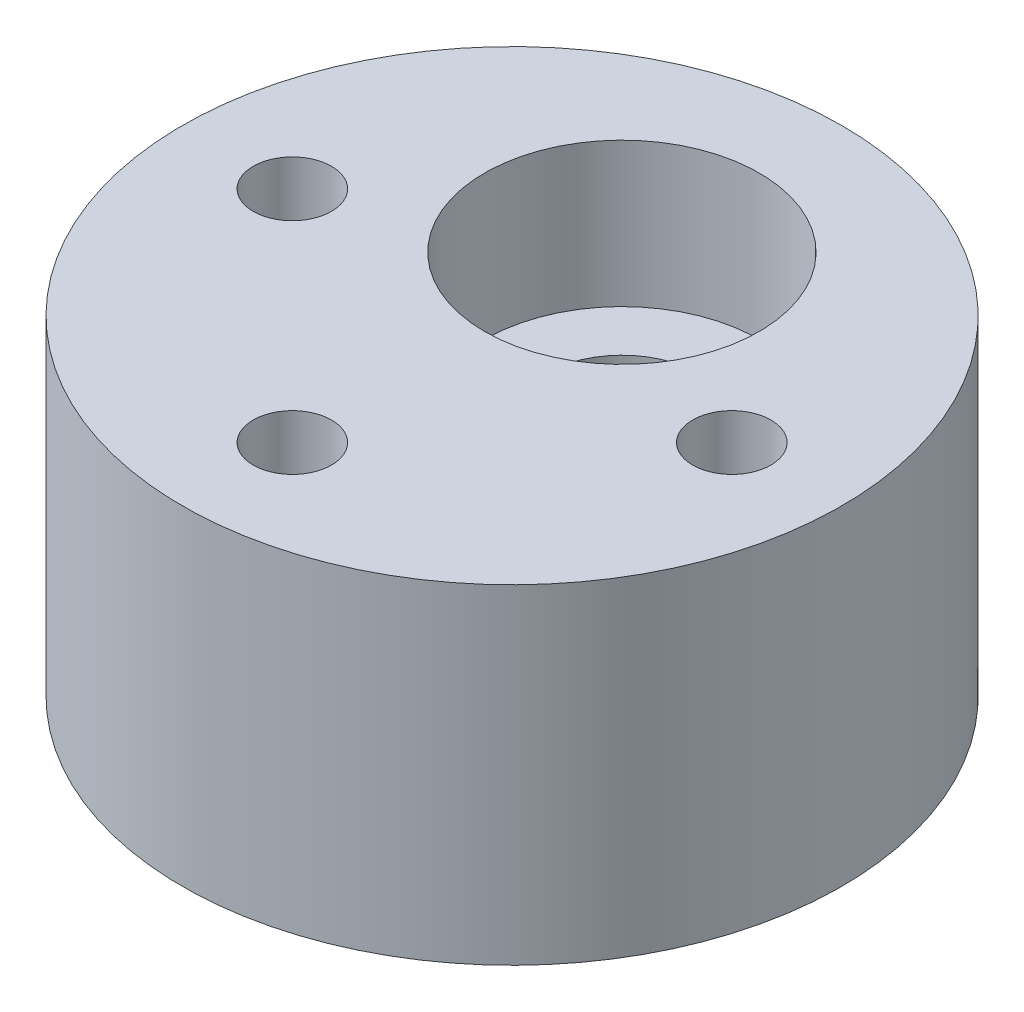
ISO-10303-21;
HEADER;
FILE_DESCRIPTION(('STEP AP214'),'2;1');
FILE_NAME('part.step','',(''),(''),'','','');
FILE_SCHEMA(('AUTOMOTIVE_DESIGN { 1 0 10303 214 1 1 1 1 }'));
ENDSEC;
DATA;
#1=APPLICATION_CONTEXT('core data for automotive mechanical design processes');
#2=APPLICATION_PROTOCOL_DEFINITION('international standard','automotive_design',2000,#1);
#3=PRODUCT_CONTEXT('',#1,'mechanical');
#4=PRODUCT('Part','Part','',(#3));
#5=PRODUCT_RELATED_PRODUCT_CATEGORY('part','',(#4));
#6=PRODUCT_DEFINITION_FORMATION('','',#4);
#7=PRODUCT_DEFINITION_CONTEXT('part definition',#1,'design');
#8=PRODUCT_DEFINITION('design','',#6,#7);
#9=PRODUCT_DEFINITION_SHAPE('','',#8);
#10=(LENGTH_UNIT() NAMED_UNIT(*) SI_UNIT(.MILLI.,.METRE.));
#11=(NAMED_UNIT(*) PLANE_ANGLE_UNIT() SI_UNIT($,.RADIAN.));
#12=(NAMED_UNIT(*) SI_UNIT($,.STERADIAN.) SOLID_ANGLE_UNIT());
#13=UNCERTAINTY_MEASURE_WITH_UNIT(LENGTH_MEASURE(1.E-05),#10,'distance_accuracy_value','');
#14=(GEOMETRIC_REPRESENTATION_CONTEXT(3) GLOBAL_UNCERTAINTY_ASSIGNED_CONTEXT((#13)) GLOBAL_UNIT_ASSIGNED_CONTEXT((#10,
#11,#12)) REPRESENTATION_CONTEXT('',''));
#15=CARTESIAN_POINT('',(0.,0.,0.));
#16=DIRECTION('',(0.,0.,1.));
#17=DIRECTION('',(1.,0.,0.));
#18=AXIS2_PLACEMENT_3D('',#15,#16,#17);
#19=CARTESIAN_POINT('',(0.,9.525,0.));
#20=DIRECTION('',(0.,-1.,0.));
#21=DIRECTION('',(0.,0.,-1.));
#22=AXIS2_PLACEMENT_3D('',#19,#20,#21);
#23=CYLINDRICAL_SURFACE('',#22,9.525);
#24=CARTESIAN_POINT('',(0.,9.525,0.));
#25=DIRECTION('',(0.,1.,0.));
#26=DIRECTION('',(0.,0.,1.));
#27=AXIS2_PLACEMENT_3D('',#24,#25,#26);
#28=CIRCLE('',#27,9.525);
#29=CARTESIAN_POINT('',(0.,9.525,-9.525));
#30=VERTEX_POINT('',#29);
#31=EDGE_CURVE('E11',#30,#30,#28,.T.);
#32=CARTESIAN_POINT('',(0.,0.,0.));
#33=DIRECTION('',(0.,1.,0.));
#34=DIRECTION('',(0.,0.,1.));
#35=AXIS2_PLACEMENT_3D('',#32,#33,#34);
#36=CIRCLE('',#35,9.525);
#37=CARTESIAN_POINT('',(0.,0.,-9.525));
#38=VERTEX_POINT('',#37);
#39=EDGE_CURVE('E43',#38,#38,#36,.T.);
#40=CARTESIAN_POINT('',(0.,9.525,-9.525));
#41=CARTESIAN_POINT('',(0.,9.42578125,-9.525));
#42=CARTESIAN_POINT('',(0.,9.3265625,-9.525));
#43=CARTESIAN_POINT('',(0.,9.128125,-9.525));
#44=CARTESIAN_POINT('',(0.,9.02890625,-9.525));
#45=CARTESIAN_POINT('',(0.,8.83046875,-9.525));
#46=CARTESIAN_POINT('',(0.,8.73125,-9.525));
#47=CARTESIAN_POINT('',(0.,8.5328125,-9.525));
#48=CARTESIAN_POINT('',(0.,8.43359375,-9.525));
#49=CARTESIAN_POINT('',(0.,8.23515625,-9.525));
#50=CARTESIAN_POINT('',(0.,8.1359375,-9.525));
#51=CARTESIAN_POINT('',(0.,7.9375,-9.525));
#52=CARTESIAN_POINT('',(0.,7.83828125,-9.525));
#53=CARTESIAN_POINT('',(0.,7.63984375,-9.525));
#54=CARTESIAN_POINT('',(0.,7.540625,-9.525));
#55=CARTESIAN_POINT('',(0.,7.3421875,-9.525));
#56=CARTESIAN_POINT('',(0.,7.24296875,-9.525));
#57=CARTESIAN_POINT('',(0.,7.04453125,-9.525));
#58=CARTESIAN_POINT('',(0.,6.9453125,-9.525));
#59=CARTESIAN_POINT('',(0.,6.746875,-9.525));
#60=CARTESIAN_POINT('',(0.,6.64765625,-9.525));
#61=CARTESIAN_POINT('',(0.,6.44921875,-9.525));
#62=CARTESIAN_POINT('',(0.,6.35,-9.525));
#63=CARTESIAN_POINT('',(0.,6.1515625,-9.525));
#64=CARTESIAN_POINT('',(0.,6.05234375,-9.525));
#65=CARTESIAN_POINT('',(0.,5.85390625,-9.525));
#66=CARTESIAN_POINT('',(0.,5.7546875,-9.525));
#67=CARTESIAN_POINT('',(0.,5.55625,-9.525));
#68=CARTESIAN_POINT('',(0.,5.45703125,-9.525));
#69=CARTESIAN_POINT('',(0.,5.25859375,-9.525));
#70=CARTESIAN_POINT('',(0.,5.159375,-9.525));
#71=CARTESIAN_POINT('',(0.,4.9609375,-9.525));
#72=CARTESIAN_POINT('',(0.,4.86171875,-9.525));
#73=CARTESIAN_POINT('',(0.,4.66328125,-9.525));
#74=CARTESIAN_POINT('',(0.,4.5640625,-9.525));
#75=CARTESIAN_POINT('',(0.,4.365625,-9.525));
#76=CARTESIAN_POINT('',(0.,4.26640625,-9.525));
#77=CARTESIAN_POINT('',(0.,4.06796875,-9.525));
#78=CARTESIAN_POINT('',(0.,3.96875,-9.525));
#79=CARTESIAN_POINT('',(0.,3.7703125,-9.525));
#80=CARTESIAN_POINT('',(0.,3.67109375,-9.525));
#81=CARTESIAN_POINT('',(0.,3.47265625,-9.525));
#82=CARTESIAN_POINT('',(0.,3.3734375,-9.525));
#83=CARTESIAN_POINT('',(0.,3.175,-9.525));
#84=CARTESIAN_POINT('',(0.,3.07578125,-9.525));
#85=CARTESIAN_POINT('',(0.,2.87734375,-9.525));
#86=CARTESIAN_POINT('',(0.,2.778125,-9.525));
#87=CARTESIAN_POINT('',(0.,2.5796875,-9.525));
#88=CARTESIAN_POINT('',(0.,2.48046875,-9.525));
#89=CARTESIAN_POINT('',(0.,2.28203125,-9.525));
#90=CARTESIAN_POINT('',(0.,2.1828125,-9.525));
#91=CARTESIAN_POINT('',(0.,1.984375,-9.525));
#92=CARTESIAN_POINT('',(0.,1.88515625,-9.525));
#93=CARTESIAN_POINT('',(0.,1.68671875,-9.525));
#94=CARTESIAN_POINT('',(0.,1.5875,-9.525));
#95=CARTESIAN_POINT('',(0.,1.3890625,-9.525));
#96=CARTESIAN_POINT('',(0.,1.28984375,-9.525));
#97=CARTESIAN_POINT('',(0.,1.09140625,-9.525));
#98=CARTESIAN_POINT('',(0.,0.992187500000001,-9.525));
#99=CARTESIAN_POINT('',(0.,0.793750000000001,-9.525));
#100=CARTESIAN_POINT('',(0.,0.69453125,-9.525));
#101=CARTESIAN_POINT('',(0.,0.49609375,-9.525));
#102=CARTESIAN_POINT('',(0.,0.396875,-9.525));
#103=CARTESIAN_POINT('',(0.,0.1984375,-9.525));
#104=CARTESIAN_POINT('',(0.,0.0992187500000001,-9.525));
#105=CARTESIAN_POINT('',(0.,0.,-9.525));
#106=B_SPLINE_CURVE_WITH_KNOTS('',3,(#40,#41,#42,#43,#44,#45,#46,#47,#48,#49,#50,#51,#52,#53,
#54,#55,#56,#57,#58,#59,#60,#61,#62,#63,#64,#65,#66,#67,#68,#69,#70,#71,#72,#73,#74,#75,#76,#77,
#78,#79,#80,#81,#82,#83,#84,#85,#86,#87,#88,#89,#90,#91,#92,#93,#94,#95,#96,#97,#98,#99,#100,
#101,#102,#103,#104,#105),.UNSPECIFIED.,.F.,.F.,(4,2,2,2,2,2,2,2,2,2,2,2,2,2,2,2,2,2,2,2,2,2,2,
2,2,2,2,2,2,2,2,2,4),(0.,0.29765625,0.5953125,0.892968750000001,1.190625,1.48828125,1.7859375,
2.08359375,2.38125,2.67890625,2.9765625,3.27421875,3.571875,3.86953125,4.1671875,4.46484375,
4.7625,5.06015625,5.3578125,5.65546875,5.953125,6.25078125,6.5484375,6.84609375,7.14375,
7.44140625,7.7390625,8.03671875,8.334375,8.63203125,8.9296875,9.22734375,9.525),.UNSPECIFIED.);
#107=EDGE_CURVE('BSEAM40',#30,#38,#106,.T.);
#108=ORIENTED_EDGE('',*,*,#31,.F.);
#109=ORIENTED_EDGE('',*,*,#39,.T.);
#110=ORIENTED_EDGE('',*,*,#107,.T.);
#111=ORIENTED_EDGE('',*,*,#107,.F.);
#112=EDGE_LOOP('',(#108,#110,#109,#111));
#113=FACE_BOUND('',#112,.T.);
#114=ADVANCED_FACE('F40',(#113),#23,.T.);
#115=CARTESIAN_POINT('',(0.,9.525,0.));
#116=DIRECTION('',(0.,1.,0.));
#117=DIRECTION('',(0.,0.,1.));
#118=AXIS2_PLACEMENT_3D('',#115,#116,#117);
#119=PLANE('',#118);
#120=CARTESIAN_POINT('',(-6.35,9.525,0.));
#121=DIRECTION('',(0.,1.,0.));
#122=DIRECTION('',(0.,0.,1.));
#123=AXIS2_PLACEMENT_3D('',#120,#121,#122);
#124=CIRCLE('',#123,1.13029999999999);
#125=CARTESIAN_POINT('',(-6.35,9.525,1.13029999999999));
#126=VERTEX_POINT('',#125);
#127=EDGE_CURVE('E73',#126,#126,#124,.T.);
#128=ORIENTED_EDGE('',*,*,#127,.F.);
#129=EDGE_LOOP('',(#128));
#130=FACE_BOUND('',#129,.T.);
#131=CARTESIAN_POINT('',(6.35,9.525,0.));
#132=DIRECTION('',(0.,1.,0.));
#133=DIRECTION('',(0.,0.,1.));
#134=AXIS2_PLACEMENT_3D('',#131,#132,#133);
#135=CIRCLE('',#134,1.13029999999999);
#136=CARTESIAN_POINT('',(6.35,9.525,1.13029999999999));
#137=VERTEX_POINT('',#136);
#138=EDGE_CURVE('E72',#137,#137,#135,.T.);
#139=ORIENTED_EDGE('',*,*,#138,.F.);
#140=EDGE_LOOP('',(#139));
#141=FACE_BOUND('',#140,.T.);
#142=CARTESIAN_POINT('',(0.,9.525,6.35));
#143=DIRECTION('',(0.,1.,0.));
#144=DIRECTION('',(0.,0.,1.));
#145=AXIS2_PLACEMENT_3D('',#142,#143,#144);
#146=CIRCLE('',#145,1.13029999999999);
#147=CARTESIAN_POINT('',(0.,9.525,7.48029999999999));
#148=VERTEX_POINT('',#147);
#149=EDGE_CURVE('E86',#148,#148,#146,.T.);
#150=ORIENTED_EDGE('',*,*,#149,.F.);
#151=EDGE_LOOP('',(#150));
#152=FACE_BOUND('',#151,.T.);
#153=CARTESIAN_POINT('',(0.,9.525,-3.175));
#154=DIRECTION('',(0.,1.,0.));
#155=DIRECTION('',(0.,0.,1.));
#156=AXIS2_PLACEMENT_3D('',#153,#154,#155);
#157=CIRCLE('',#156,3.96875);
#158=CARTESIAN_POINT('',(0.,9.525,0.79375));
#159=VERTEX_POINT('',#158);
#160=EDGE_CURVE('E102',#159,#159,#157,.T.);
#161=ORIENTED_EDGE('',*,*,#160,.F.);
#162=EDGE_LOOP('',(#161));
#163=FACE_BOUND('',#162,.T.);
#164=ORIENTED_EDGE('',*,*,#31,.T.);
#165=EDGE_LOOP('',(#164));
#166=FACE_BOUND('',#165,.T.);
#167=ADVANCED_FACE('F127',(#130,#141,#152,#163,#166),#119,.T.);
#168=CARTESIAN_POINT('',(0.,0.,0.));
#169=DIRECTION('',(0.,1.,0.));
#170=DIRECTION('',(0.,0.,1.));
#171=AXIS2_PLACEMENT_3D('',#168,#169,#170);
#172=PLANE('',#171);
#173=CARTESIAN_POINT('',(0.,0.,0.381));
#174=DIRECTION('',(0.,-1.,0.));
#175=DIRECTION('',(0.,0.,-1.));
#176=AXIS2_PLACEMENT_3D('',#173,#174,#175);
#177=CIRCLE('',#176,0.793749999999989);
#178=CARTESIAN_POINT('',(0.,0.,-0.412749999999989));
#179=VERTEX_POINT('',#178);
#180=EDGE_CURVE('E94',#179,#179,#177,.T.);
#181=ORIENTED_EDGE('',*,*,#180,.F.);
#182=EDGE_LOOP('',(#181));
#183=FACE_BOUND('',#182,.T.);
#184=CARTESIAN_POINT('',(0.,0.,-3.175));
#185=DIRECTION('',(0.,1.,0.));
#186=DIRECTION('',(0.,0.,1.));
#187=AXIS2_PLACEMENT_3D('',#184,#185,#186);
#188=CIRCLE('',#187,2.2479);
#189=CARTESIAN_POINT('',(0.,0.,-0.927100000000002));
#190=VERTEX_POINT('',#189);
#191=EDGE_CURVE('E114',#190,#190,#188,.T.);
#192=ORIENTED_EDGE('',*,*,#191,.T.);
#193=EDGE_LOOP('',(#192));
#194=FACE_BOUND('',#193,.T.);
#195=ORIENTED_EDGE('',*,*,#39,.F.);
#196=EDGE_LOOP('',(#195));
#197=FACE_BOUND('',#196,.T.);
#198=ADVANCED_FACE('F124',(#183,#194,#197),#172,.F.);
#199=CARTESIAN_POINT('',(0.,9.525,-3.175));
#200=DIRECTION('',(0.,1.,0.));
#201=DIRECTION('',(0.,0.,1.));
#202=AXIS2_PLACEMENT_3D('',#199,#200,#201);
#203=CYLINDRICAL_SURFACE('',#202,2.2479);
#204=ORIENTED_EDGE('',*,*,#191,.F.);
#205=EDGE_LOOP('',(#204));
#206=FACE_BOUND('',#205,.T.);
#207=CARTESIAN_POINT('',(0.,5.3594,-3.175));
#208=DIRECTION('',(0.,1.,0.));
#209=DIRECTION('',(0.,0.,1.));
#210=AXIS2_PLACEMENT_3D('',#207,#208,#209);
#211=CIRCLE('',#210,2.2479);
#212=CARTESIAN_POINT('',(0.,5.3594,-0.9271));
#213=VERTEX_POINT('',#212);
#214=EDGE_CURVE('E110',#213,#213,#211,.T.);
#215=ORIENTED_EDGE('',*,*,#214,.T.);
#216=EDGE_LOOP('',(#215));
#217=FACE_BOUND('',#216,.T.);
#218=ADVANCED_FACE('F126',(#206,#217),#203,.F.);
#219=CARTESIAN_POINT('',(2.2479,5.3594,-3.175));
#220=DIRECTION('',(0.,-1.,0.));
#221=DIRECTION('',(0.,0.,-1.));
#222=AXIS2_PLACEMENT_3D('',#219,#220,#221);
#223=PLANE('',#222);
#224=ORIENTED_EDGE('',*,*,#214,.F.);
#225=EDGE_LOOP('',(#224));
#226=FACE_BOUND('',#225,.T.);
#227=CARTESIAN_POINT('',(0.,5.3594,-3.175));
#228=DIRECTION('',(0.,1.,0.));
#229=DIRECTION('',(0.,0.,1.));
#230=AXIS2_PLACEMENT_3D('',#227,#228,#229);
#231=CIRCLE('',#230,3.96875);
#232=CARTESIAN_POINT('',(0.,5.3594,0.79375));
#233=VERTEX_POINT('',#232);
#234=EDGE_CURVE('E106',#233,#233,#231,.T.);
#235=ORIENTED_EDGE('',*,*,#234,.T.);
#236=EDGE_LOOP('',(#235));
#237=FACE_BOUND('',#236,.T.);
#238=ADVANCED_FACE('F133',(#226,#237),#223,.F.);
#239=CARTESIAN_POINT('',(0.,9.525,-3.175));
#240=DIRECTION('',(0.,1.,0.));
#241=DIRECTION('',(0.,0.,1.));
#242=AXIS2_PLACEMENT_3D('',#239,#240,#241);
#243=CYLINDRICAL_SURFACE('',#242,3.96875);
#244=ORIENTED_EDGE('',*,*,#234,.F.);
#245=EDGE_LOOP('',(#244));
#246=FACE_BOUND('',#245,.T.);
#247=ORIENTED_EDGE('',*,*,#160,.T.);
#248=EDGE_LOOP('',(#247));
#249=FACE_BOUND('',#248,.T.);
#250=ADVANCED_FACE('F238',(#246,#249),#243,.F.);
#251=CARTESIAN_POINT('',(0.,4.826,0.381));
#252=DIRECTION('',(0.,-1.,0.));
#253=DIRECTION('',(0.,0.,-1.));
#254=AXIS2_PLACEMENT_3D('',#251,#252,#253);
#255=CONICAL_SURFACE('',#254,0.793749999999999,1.02974425867665);
#256=CARTESIAN_POINT('',(0.,5.30293311635313,0.381));
#257=VERTEX_POINT('',#256);
#258=VERTEX_LOOP('',#257);
#259=FACE_BOUND('',#258,.T.);
#260=CARTESIAN_POINT('',(0.,4.826,0.381));
#261=DIRECTION('',(0.,-1.,0.));
#262=DIRECTION('',(0.,0.,-1.));
#263=AXIS2_PLACEMENT_3D('',#260,#261,#262);
#264=CIRCLE('',#263,0.793749999999999);
#265=CARTESIAN_POINT('',(0.,4.826,-0.412749999999999));
#266=VERTEX_POINT('',#265);
#267=EDGE_CURVE('E98',#266,#266,#264,.T.);
#268=ORIENTED_EDGE('',*,*,#267,.T.);
#269=EDGE_LOOP('',(#268));
#270=FACE_BOUND('',#269,.T.);
#271=ADVANCED_FACE('F234',(#259,#270),#255,.F.);
#272=CARTESIAN_POINT('',(0.,0.,0.381));
#273=DIRECTION('',(0.,-1.,0.));
#274=DIRECTION('',(0.,0.,-1.));
#275=AXIS2_PLACEMENT_3D('',#272,#273,#274);
#276=CYLINDRICAL_SURFACE('',#275,0.793749999999994);
#277=ORIENTED_EDGE('',*,*,#267,.F.);
#278=EDGE_LOOP('',(#277));
#279=FACE_BOUND('',#278,.T.);
#280=ORIENTED_EDGE('',*,*,#180,.T.);
#281=EDGE_LOOP('',(#280));
#282=FACE_BOUND('',#281,.T.);
#283=ADVANCED_FACE('F157',(#279,#282),#276,.F.);
#284=CARTESIAN_POINT('',(0.,3.175,6.35));
#285=DIRECTION('',(0.,1.,0.));
#286=DIRECTION('',(0.,0.,1.));
#287=AXIS2_PLACEMENT_3D('',#284,#285,#286);
#288=CONICAL_SURFACE('',#287,1.1303,1.02974425867665);
#289=CARTESIAN_POINT('',(0.,2.49584724231315,6.35));
#290=VERTEX_POINT('',#289);
#291=VERTEX_LOOP('',#290);
#292=FACE_BOUND('',#291,.T.);
#293=CARTESIAN_POINT('',(0.,3.175,6.35));
#294=DIRECTION('',(0.,1.,0.));
#295=DIRECTION('',(0.,0.,1.));
#296=AXIS2_PLACEMENT_3D('',#293,#294,#295);
#297=CIRCLE('',#296,1.1303);
#298=CARTESIAN_POINT('',(0.,3.175,7.4803));
#299=VERTEX_POINT('',#298);
#300=EDGE_CURVE('E90',#299,#299,#297,.T.);
#301=ORIENTED_EDGE('',*,*,#300,.T.);
#302=EDGE_LOOP('',(#301));
#303=FACE_BOUND('',#302,.T.);
#304=ADVANCED_FACE('F162',(#292,#303),#288,.F.);
#305=CARTESIAN_POINT('',(0.,9.525,6.35));
#306=DIRECTION('',(0.,1.,0.));
#307=DIRECTION('',(0.,0.,1.));
#308=AXIS2_PLACEMENT_3D('',#305,#306,#307);
#309=CYLINDRICAL_SURFACE('',#308,1.13029999999999);
#310=ORIENTED_EDGE('',*,*,#300,.F.);
#311=EDGE_LOOP('',(#310));
#312=FACE_BOUND('',#311,.T.);
#313=ORIENTED_EDGE('',*,*,#149,.T.);
#314=EDGE_LOOP('',(#313));
#315=FACE_BOUND('',#314,.T.);
#316=ADVANCED_FACE('F167',(#312,#315),#309,.F.);
#317=CARTESIAN_POINT('',(6.35,3.175,0.));
#318=DIRECTION('',(0.,1.,0.));
#319=DIRECTION('',(0.,0.,1.));
#320=AXIS2_PLACEMENT_3D('',#317,#318,#319);
#321=CONICAL_SURFACE('',#320,1.1303,1.02974425867665);
#322=CARTESIAN_POINT('',(6.35,2.49584724231315,0.));
#323=VERTEX_POINT('',#322);
#324=VERTEX_LOOP('',#323);
#325=FACE_BOUND('',#324,.T.);
#326=CARTESIAN_POINT('',(6.35,3.175,0.));
#327=DIRECTION('',(0.,1.,0.));
#328=DIRECTION('',(0.,0.,1.));
#329=AXIS2_PLACEMENT_3D('',#326,#327,#328);
#330=CIRCLE('',#329,1.1303);
#331=CARTESIAN_POINT('',(6.35,3.175,1.1303));
#332=VERTEX_POINT('',#331);
#333=EDGE_CURVE('E78',#332,#332,#330,.T.);
#334=ORIENTED_EDGE('',*,*,#333,.T.);
#335=EDGE_LOOP('',(#334));
#336=FACE_BOUND('',#335,.T.);
#337=ADVANCED_FACE('F177',(#325,#336),#321,.F.);
#338=CARTESIAN_POINT('',(6.35,9.525,0.));
#339=DIRECTION('',(0.,1.,0.));
#340=DIRECTION('',(0.,0.,1.));
#341=AXIS2_PLACEMENT_3D('',#338,#339,#340);
#342=CYLINDRICAL_SURFACE('',#341,1.13029999999999);
#343=ORIENTED_EDGE('',*,*,#333,.F.);
#344=EDGE_LOOP('',(#343));
#345=FACE_BOUND('',#344,.T.);
#346=ORIENTED_EDGE('',*,*,#138,.T.);
#347=EDGE_LOOP('',(#346));
#348=FACE_BOUND('',#347,.T.);
#349=ADVANCED_FACE('F65',(#345,#348),#342,.F.);
#350=CARTESIAN_POINT('',(-6.35,3.175,0.));
#351=DIRECTION('',(0.,1.,0.));
#352=DIRECTION('',(0.,0.,1.));
#353=AXIS2_PLACEMENT_3D('',#350,#351,#352);
#354=CONICAL_SURFACE('',#353,1.1303,1.02974425867665);
#355=CARTESIAN_POINT('',(-6.35,2.49584724231315,0.));
#356=VERTEX_POINT('',#355);
#357=VERTEX_LOOP('',#356);
#358=FACE_BOUND('',#357,.T.);
#359=CARTESIAN_POINT('',(-6.35,3.175,0.));
#360=DIRECTION('',(0.,1.,0.));
#361=DIRECTION('',(0.,0.,1.));
#362=AXIS2_PLACEMENT_3D('',#359,#360,#361);
#363=CIRCLE('',#362,1.1303);
#364=CARTESIAN_POINT('',(-6.35,3.175,1.1303));
#365=VERTEX_POINT('',#364);
#366=EDGE_CURVE('E69',#365,#365,#363,.T.);
#367=ORIENTED_EDGE('',*,*,#366,.T.);
#368=EDGE_LOOP('',(#367));
#369=FACE_BOUND('',#368,.T.);
#370=ADVANCED_FACE('F61',(#358,#369),#354,.F.);
#371=CARTESIAN_POINT('',(-6.35,9.525,0.));
#372=DIRECTION('',(0.,1.,0.));
#373=DIRECTION('',(0.,0.,1.));
#374=AXIS2_PLACEMENT_3D('',#371,#372,#373);
#375=CYLINDRICAL_SURFACE('',#374,1.13029999999999);
#376=ORIENTED_EDGE('',*,*,#366,.F.);
#377=EDGE_LOOP('',(#376));
#378=FACE_BOUND('',#377,.T.);
#379=ORIENTED_EDGE('',*,*,#127,.T.);
#380=EDGE_LOOP('',(#379));
#381=FACE_BOUND('',#380,.T.);
#382=ADVANCED_FACE('F64',(#378,#381),#375,.F.);
#383=CLOSED_SHELL('',(#114,#167,#198,#218,#238,#250,#271,#283,#304,#316,#337,#349,#370,#382));
#384=MANIFOLD_SOLID_BREP('B2',#383);
#385=ADVANCED_BREP_SHAPE_REPRESENTATION('',(#18,#384),#14);
#386=SHAPE_DEFINITION_REPRESENTATION(#9,#385);
ENDSEC;
END-ISO-10303-21;
